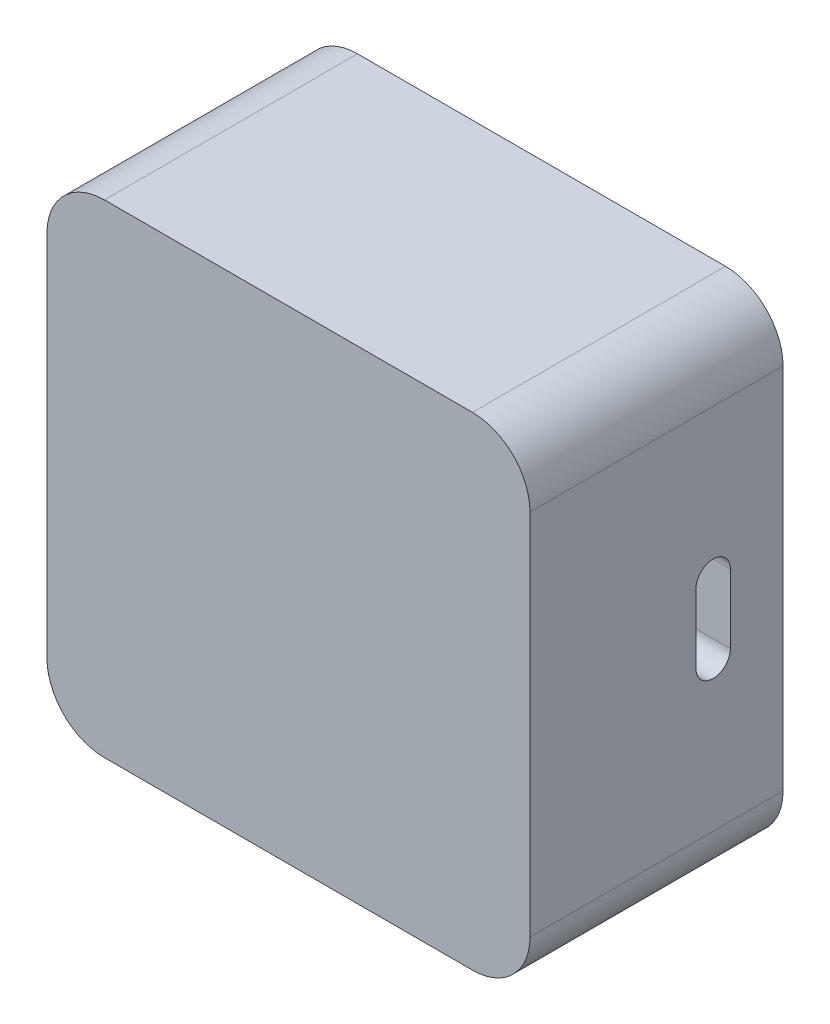
ISO-10303-21;
HEADER;
FILE_DESCRIPTION(('STEP AP214'),'2;1');
FILE_NAME('part.step','',(''),(''),'','','');
FILE_SCHEMA(('AUTOMOTIVE_DESIGN { 1 0 10303 214 1 1 1 1 }'));
ENDSEC;
DATA;
#1=APPLICATION_CONTEXT('core data for automotive mechanical design processes');
#2=APPLICATION_PROTOCOL_DEFINITION('international standard','automotive_design',2000,#1);
#3=PRODUCT_CONTEXT('',#1,'mechanical');
#4=PRODUCT('Part','Part','',(#3));
#5=PRODUCT_RELATED_PRODUCT_CATEGORY('part','',(#4));
#6=PRODUCT_DEFINITION_FORMATION('','',#4);
#7=PRODUCT_DEFINITION_CONTEXT('part definition',#1,'design');
#8=PRODUCT_DEFINITION('design','',#6,#7);
#9=PRODUCT_DEFINITION_SHAPE('','',#8);
#10=(LENGTH_UNIT() NAMED_UNIT(*) SI_UNIT(.MILLI.,.METRE.));
#11=(NAMED_UNIT(*) PLANE_ANGLE_UNIT() SI_UNIT($,.RADIAN.));
#12=(NAMED_UNIT(*) SI_UNIT($,.STERADIAN.) SOLID_ANGLE_UNIT());
#13=UNCERTAINTY_MEASURE_WITH_UNIT(LENGTH_MEASURE(1.E-05),#10,'distance_accuracy_value','');
#14=(GEOMETRIC_REPRESENTATION_CONTEXT(3) GLOBAL_UNCERTAINTY_ASSIGNED_CONTEXT((#13)) GLOBAL_UNIT_ASSIGNED_CONTEXT((#10,
#11,#12)) REPRESENTATION_CONTEXT('',''));
#15=CARTESIAN_POINT('',(0.,0.,0.));
#16=DIRECTION('',(0.,0.,1.));
#17=DIRECTION('',(1.,0.,0.));
#18=AXIS2_PLACEMENT_3D('',#15,#16,#17);
#19=CARTESIAN_POINT('',(-21.,21.,22.));
#20=DIRECTION('',(1.,0.,0.));
#21=DIRECTION('',(0.,0.,-1.));
#22=AXIS2_PLACEMENT_3D('',#19,#20,#21);
#23=PLANE('',#22);
#24=DIRECTION('',(0.,-1.,0.));
#25=VECTOR('',#24,1.);
#26=CARTESIAN_POINT('',(-21.,21.,22.));
#27=LINE('',#26,#25);
#28=CARTESIAN_POINT('',(-21.,16.,22.));
#29=VERTEX_POINT('',#28);
#30=CARTESIAN_POINT('',(-21.,-16.,22.));
#31=VERTEX_POINT('',#30);
#32=EDGE_CURVE('E175',#29,#31,#27,.T.);
#33=ORIENTED_EDGE('',*,*,#32,.F.);
#34=DIRECTION('',(0.,0.,-1.));
#35=VECTOR('',#34,1.);
#36=CARTESIAN_POINT('',(-21.,16.,22.));
#37=LINE('',#36,#35);
#38=CARTESIAN_POINT('',(-21.,16.,0.));
#39=VERTEX_POINT('',#38);
#40=EDGE_CURVE('E197',#29,#39,#37,.T.);
#41=ORIENTED_EDGE('',*,*,#40,.T.);
#42=DIRECTION('',(0.,-1.,0.));
#43=VECTOR('',#42,1.);
#44=CARTESIAN_POINT('',(-21.,21.,0.));
#45=LINE('',#44,#43);
#46=CARTESIAN_POINT('',(-21.,-16.,0.));
#47=VERTEX_POINT('',#46);
#48=EDGE_CURVE('E171',#39,#47,#45,.T.);
#49=ORIENTED_EDGE('',*,*,#48,.T.);
#50=DIRECTION('',(0.,0.,-1.));
#51=VECTOR('',#50,1.);
#52=CARTESIAN_POINT('',(-21.,-16.,22.));
#53=LINE('',#52,#51);
#54=EDGE_CURVE('E186',#47,#31,#53,.F.);
#55=ORIENTED_EDGE('',*,*,#54,.T.);
#56=EDGE_LOOP('',(#33,#41,#49,#55));
#57=FACE_BOUND('',#56,.T.);
#58=ADVANCED_FACE('F39',(#57),#23,.F.);
#59=CARTESIAN_POINT('',(-21.,-21.,22.));
#60=DIRECTION('',(0.,1.,0.));
#61=DIRECTION('',(0.,0.,1.));
#62=AXIS2_PLACEMENT_3D('',#59,#60,#61);
#63=PLANE('',#62);
#64=CARTESIAN_POINT('',(1.56319401867222E-10,-21.,10.9999999999957));
#65=DIRECTION('',(0.,-1.,0.));
#66=DIRECTION('',(0.,0.,-1.));
#67=AXIS2_PLACEMENT_3D('',#64,#65,#66);
#68=CIRCLE('',#67,4.);
#69=CARTESIAN_POINT('',(1.56319401867222E-10,-21.,6.99999999999568));
#70=VERTEX_POINT('',#69);
#71=EDGE_CURVE('E158',#70,#70,#68,.T.);
#72=ORIENTED_EDGE('',*,*,#71,.F.);
#73=EDGE_LOOP('',(#72));
#74=FACE_BOUND('',#73,.T.);
#75=DIRECTION('',(1.,0.,0.));
#76=VECTOR('',#75,1.);
#77=CARTESIAN_POINT('',(-21.,-21.,22.));
#78=LINE('',#77,#76);
#79=CARTESIAN_POINT('',(-16.,-21.,22.));
#80=VERTEX_POINT('',#79);
#81=CARTESIAN_POINT('',(16.,-21.,22.));
#82=VERTEX_POINT('',#81);
#83=EDGE_CURVE('E178',#80,#82,#78,.T.);
#84=ORIENTED_EDGE('',*,*,#83,.F.);
#85=DIRECTION('',(0.,0.,-1.));
#86=VECTOR('',#85,1.);
#87=CARTESIAN_POINT('',(-16.,-21.,22.));
#88=LINE('',#87,#86);
#89=CARTESIAN_POINT('',(-16.,-21.,0.));
#90=VERTEX_POINT('',#89);
#91=EDGE_CURVE('E222',#80,#90,#88,.T.);
#92=ORIENTED_EDGE('',*,*,#91,.T.);
#93=DIRECTION('',(1.,0.,0.));
#94=VECTOR('',#93,1.);
#95=CARTESIAN_POINT('',(-21.,-21.,0.));
#96=LINE('',#95,#94);
#97=CARTESIAN_POINT('',(16.,-21.,0.));
#98=VERTEX_POINT('',#97);
#99=EDGE_CURVE('E189',#90,#98,#96,.T.);
#100=ORIENTED_EDGE('',*,*,#99,.T.);
#101=DIRECTION('',(0.,0.,-1.));
#102=VECTOR('',#101,1.);
#103=CARTESIAN_POINT('',(16.,-21.,22.));
#104=LINE('',#103,#102);
#105=EDGE_CURVE('E220',#98,#82,#104,.F.);
#106=ORIENTED_EDGE('',*,*,#105,.T.);
#107=EDGE_LOOP('',(#84,#92,#100,#106));
#108=FACE_BOUND('',#107,.T.);
#109=ADVANCED_FACE('F228',(#74,#108),#63,.F.);
#110=CARTESIAN_POINT('',(21.,21.,22.));
#111=DIRECTION('',(-1.,0.,0.));
#112=DIRECTION('',(0.,0.,1.));
#113=AXIS2_PLACEMENT_3D('',#110,#111,#112);
#114=PLANE('',#113);
#115=DIRECTION('',(0.,-1.,0.));
#116=VECTOR('',#115,1.);
#117=CARTESIAN_POINT('',(21.,0.,7.57507844989522));
#118=LINE('',#117,#116);
#119=CARTESIAN_POINT('',(21.,3.,7.57507844989522));
#120=VERTEX_POINT('',#119);
#121=CARTESIAN_POINT('',(21.,-3.00000000000001,7.57507844989522));
#122=VERTEX_POINT('',#121);
#123=EDGE_CURVE('E164',#120,#122,#118,.T.);
#124=ORIENTED_EDGE('',*,*,#123,.F.);
#125=CARTESIAN_POINT('',(21.,3.,6.07507844989522));
#126=DIRECTION('',(1.,0.,0.));
#127=DIRECTION('',(0.,0.,-1.));
#128=AXIS2_PLACEMENT_3D('',#125,#126,#127);
#129=CIRCLE('',#128,1.5);
#130=CARTESIAN_POINT('',(21.,3.,4.57507844989522));
#131=VERTEX_POINT('',#130);
#132=EDGE_CURVE('E135',#131,#120,#129,.T.);
#133=ORIENTED_EDGE('',*,*,#132,.F.);
#134=DIRECTION('',(0.,-1.,0.));
#135=VECTOR('',#134,1.);
#136=CARTESIAN_POINT('',(21.,0.,4.57507844989522));
#137=LINE('',#136,#135);
#138=CARTESIAN_POINT('',(21.,-3.00000000000001,4.57507844989522));
#139=VERTEX_POINT('',#138);
#140=EDGE_CURVE('E152',#131,#139,#137,.T.);
#141=ORIENTED_EDGE('',*,*,#140,.T.);
#142=CARTESIAN_POINT('',(21.,-3.00000000000001,6.07507844989522));
#143=DIRECTION('',(1.,0.,0.));
#144=DIRECTION('',(0.,0.,-1.));
#145=AXIS2_PLACEMENT_3D('',#142,#143,#144);
#146=CIRCLE('',#145,1.5);
#147=EDGE_CURVE('E155',#139,#122,#146,.F.);
#148=ORIENTED_EDGE('',*,*,#147,.T.);
#149=EDGE_LOOP('',(#124,#133,#141,#148));
#150=FACE_BOUND('',#149,.T.);
#151=DIRECTION('',(0.,1.,0.));
#152=VECTOR('',#151,1.);
#153=CARTESIAN_POINT('',(21.,21.,22.));
#154=LINE('',#153,#152);
#155=CARTESIAN_POINT('',(21.,-16.,22.));
#156=VERTEX_POINT('',#155);
#157=CARTESIAN_POINT('',(21.,16.,22.));
#158=VERTEX_POINT('',#157);
#159=EDGE_CURVE('E181',#156,#158,#154,.T.);
#160=ORIENTED_EDGE('',*,*,#159,.F.);
#161=DIRECTION('',(0.,0.,-1.));
#162=VECTOR('',#161,1.);
#163=CARTESIAN_POINT('',(21.,-16.,22.));
#164=LINE('',#163,#162);
#165=CARTESIAN_POINT('',(21.,-16.,0.));
#166=VERTEX_POINT('',#165);
#167=EDGE_CURVE('E11',#156,#166,#164,.T.);
#168=ORIENTED_EDGE('',*,*,#167,.T.);
#169=DIRECTION('',(0.,1.,0.));
#170=VECTOR('',#169,1.);
#171=CARTESIAN_POINT('',(21.,21.,0.));
#172=LINE('',#171,#170);
#173=CARTESIAN_POINT('',(21.,16.,0.));
#174=VERTEX_POINT('',#173);
#175=EDGE_CURVE('E192',#166,#174,#172,.T.);
#176=ORIENTED_EDGE('',*,*,#175,.T.);
#177=DIRECTION('',(0.,0.,-1.));
#178=VECTOR('',#177,1.);
#179=CARTESIAN_POINT('',(21.,16.,22.));
#180=LINE('',#179,#178);
#181=EDGE_CURVE('E47',#174,#158,#180,.F.);
#182=ORIENTED_EDGE('',*,*,#181,.T.);
#183=EDGE_LOOP('',(#160,#168,#176,#182));
#184=FACE_BOUND('',#183,.T.);
#185=ADVANCED_FACE('F239',(#150,#184),#114,.F.);
#186=CARTESIAN_POINT('',(-21.,21.,22.));
#187=DIRECTION('',(0.,-1.,0.));
#188=DIRECTION('',(1.,0.,0.));
#189=AXIS2_PLACEMENT_3D('',#186,#187,#188);
#190=PLANE('',#189);
#191=DIRECTION('',(-1.,0.,0.));
#192=VECTOR('',#191,1.);
#193=CARTESIAN_POINT('',(-21.,21.,0.));
#194=LINE('',#193,#192);
#195=CARTESIAN_POINT('',(16.,21.,0.));
#196=VERTEX_POINT('',#195);
#197=CARTESIAN_POINT('',(-16.,21.,0.));
#198=VERTEX_POINT('',#197);
#199=EDGE_CURVE('E179',#196,#198,#194,.T.);
#200=ORIENTED_EDGE('',*,*,#199,.T.);
#201=DIRECTION('',(0.,0.,-1.));
#202=VECTOR('',#201,1.);
#203=CARTESIAN_POINT('',(-16.,21.,22.));
#204=LINE('',#203,#202);
#205=CARTESIAN_POINT('',(-16.,21.,22.));
#206=VERTEX_POINT('',#205);
#207=EDGE_CURVE('E211',#198,#206,#204,.F.);
#208=ORIENTED_EDGE('',*,*,#207,.T.);
#209=DIRECTION('',(-1.,0.,0.));
#210=VECTOR('',#209,1.);
#211=CARTESIAN_POINT('',(-21.,21.,22.));
#212=LINE('',#211,#210);
#213=CARTESIAN_POINT('',(16.,21.,22.));
#214=VERTEX_POINT('',#213);
#215=EDGE_CURVE('E183',#214,#206,#212,.T.);
#216=ORIENTED_EDGE('',*,*,#215,.F.);
#217=DIRECTION('',(0.,0.,-1.));
#218=VECTOR('',#217,1.);
#219=CARTESIAN_POINT('',(16.,21.,22.));
#220=LINE('',#219,#218);
#221=EDGE_CURVE('E208',#214,#196,#220,.T.);
#222=ORIENTED_EDGE('',*,*,#221,.T.);
#223=EDGE_LOOP('',(#200,#208,#216,#222));
#224=FACE_BOUND('',#223,.T.);
#225=ADVANCED_FACE('F247',(#224),#190,.F.);
#226=CARTESIAN_POINT('',(0.,0.,22.));
#227=DIRECTION('',(0.,0.,1.));
#228=DIRECTION('',(1.,0.,0.));
#229=AXIS2_PLACEMENT_3D('',#226,#227,#228);
#230=PLANE('',#229);
#231=ORIENTED_EDGE('',*,*,#215,.T.);
#232=CARTESIAN_POINT('',(-16.,16.,22.));
#233=DIRECTION('',(0.,0.,1.));
#234=DIRECTION('',(1.,0.,0.));
#235=AXIS2_PLACEMENT_3D('',#232,#233,#234);
#236=CIRCLE('',#235,5.);
#237=EDGE_CURVE('E218',#206,#29,#236,.T.);
#238=ORIENTED_EDGE('',*,*,#237,.T.);
#239=ORIENTED_EDGE('',*,*,#32,.T.);
#240=CARTESIAN_POINT('',(-16.,-16.,22.));
#241=DIRECTION('',(0.,0.,1.));
#242=DIRECTION('',(1.,0.,0.));
#243=AXIS2_PLACEMENT_3D('',#240,#241,#242);
#244=CIRCLE('',#243,5.);
#245=EDGE_CURVE('E216',#31,#80,#244,.T.);
#246=ORIENTED_EDGE('',*,*,#245,.T.);
#247=ORIENTED_EDGE('',*,*,#83,.T.);
#248=CARTESIAN_POINT('',(16.,-16.,22.));
#249=DIRECTION('',(0.,0.,1.));
#250=DIRECTION('',(1.,0.,0.));
#251=AXIS2_PLACEMENT_3D('',#248,#249,#250);
#252=CIRCLE('',#251,5.);
#253=EDGE_CURVE('E60',#82,#156,#252,.T.);
#254=ORIENTED_EDGE('',*,*,#253,.T.);
#255=ORIENTED_EDGE('',*,*,#159,.T.);
#256=CARTESIAN_POINT('',(16.,16.,22.));
#257=DIRECTION('',(0.,0.,1.));
#258=DIRECTION('',(1.,0.,0.));
#259=AXIS2_PLACEMENT_3D('',#256,#257,#258);
#260=CIRCLE('',#259,5.);
#261=EDGE_CURVE('E213',#158,#214,#260,.T.);
#262=ORIENTED_EDGE('',*,*,#261,.T.);
#263=EDGE_LOOP('',(#231,#238,#239,#246,#247,#254,#255,#262));
#264=FACE_BOUND('',#263,.T.);
#265=ADVANCED_FACE('F241',(#264),#230,.T.);
#266=CARTESIAN_POINT('',(0.,0.,0.));
#267=DIRECTION('',(0.,0.,1.));
#268=DIRECTION('',(1.,0.,0.));
#269=AXIS2_PLACEMENT_3D('',#266,#267,#268);
#270=PLANE('',#269);
#271=ORIENTED_EDGE('',*,*,#48,.F.);
#272=CARTESIAN_POINT('',(-16.,16.,0.));
#273=DIRECTION('',(0.,0.,1.));
#274=DIRECTION('',(1.,0.,0.));
#275=AXIS2_PLACEMENT_3D('',#272,#273,#274);
#276=CIRCLE('',#275,5.);
#277=EDGE_CURVE('E206',#39,#198,#276,.F.);
#278=ORIENTED_EDGE('',*,*,#277,.T.);
#279=ORIENTED_EDGE('',*,*,#199,.F.);
#280=CARTESIAN_POINT('',(16.,16.,0.));
#281=DIRECTION('',(0.,0.,1.));
#282=DIRECTION('',(1.,0.,0.));
#283=AXIS2_PLACEMENT_3D('',#280,#281,#282);
#284=CIRCLE('',#283,5.);
#285=EDGE_CURVE('E200',#196,#174,#284,.F.);
#286=ORIENTED_EDGE('',*,*,#285,.T.);
#287=ORIENTED_EDGE('',*,*,#175,.F.);
#288=CARTESIAN_POINT('',(16.,-16.,0.));
#289=DIRECTION('',(0.,0.,1.));
#290=DIRECTION('',(1.,0.,0.));
#291=AXIS2_PLACEMENT_3D('',#288,#289,#290);
#292=CIRCLE('',#291,5.);
#293=EDGE_CURVE('E202',#166,#98,#292,.F.);
#294=ORIENTED_EDGE('',*,*,#293,.T.);
#295=ORIENTED_EDGE('',*,*,#99,.F.);
#296=CARTESIAN_POINT('',(-16.,-16.,0.));
#297=DIRECTION('',(0.,0.,1.));
#298=DIRECTION('',(1.,0.,0.));
#299=AXIS2_PLACEMENT_3D('',#296,#297,#298);
#300=CIRCLE('',#299,5.);
#301=EDGE_CURVE('E204',#90,#47,#300,.F.);
#302=ORIENTED_EDGE('',*,*,#301,.T.);
#303=EDGE_LOOP('',(#271,#278,#279,#286,#287,#294,#295,#302));
#304=FACE_BOUND('',#303,.T.);
#305=ADVANCED_FACE('F234',(#304),#270,.F.);
#306=CARTESIAN_POINT('',(14.,3.,6.07507844989522));
#307=DIRECTION('',(1.,0.,0.));
#308=DIRECTION('',(0.,0.,-1.));
#309=AXIS2_PLACEMENT_3D('',#306,#307,#308);
#310=CYLINDRICAL_SURFACE('',#309,1.5);
#311=ORIENTED_EDGE('',*,*,#132,.T.);
#312=DIRECTION('',(1.,0.,0.));
#313=VECTOR('',#312,1.);
#314=CARTESIAN_POINT('',(14.,3.,7.57507844989522));
#315=LINE('',#314,#313);
#316=CARTESIAN_POINT('',(14.,3.,7.57507844989522));
#317=VERTEX_POINT('',#316);
#318=EDGE_CURVE('E129',#317,#120,#315,.T.);
#319=ORIENTED_EDGE('',*,*,#318,.F.);
#320=CARTESIAN_POINT('',(14.,3.,6.07507844989522));
#321=DIRECTION('',(1.,0.,0.));
#322=DIRECTION('',(0.,0.,-1.));
#323=AXIS2_PLACEMENT_3D('',#320,#321,#322);
#324=CIRCLE('',#323,1.5);
#325=CARTESIAN_POINT('',(14.,3.,4.57507844989522));
#326=VERTEX_POINT('',#325);
#327=EDGE_CURVE('E133',#326,#317,#324,.T.);
#328=ORIENTED_EDGE('',*,*,#327,.F.);
#329=DIRECTION('',(1.,0.,0.));
#330=VECTOR('',#329,1.);
#331=CARTESIAN_POINT('',(14.,3.,4.57507844989522));
#332=LINE('',#331,#330);
#333=EDGE_CURVE('E169',#326,#131,#332,.T.);
#334=ORIENTED_EDGE('',*,*,#333,.T.);
#335=EDGE_LOOP('',(#311,#319,#328,#334));
#336=FACE_BOUND('',#335,.T.);
#337=ADVANCED_FACE('F131',(#336),#310,.F.);
#338=CARTESIAN_POINT('',(14.,0.,4.57507844989522));
#339=DIRECTION('',(0.,0.,1.));
#340=DIRECTION('',(1.,0.,0.));
#341=AXIS2_PLACEMENT_3D('',#338,#339,#340);
#342=PLANE('',#341);
#343=ORIENTED_EDGE('',*,*,#140,.F.);
#344=ORIENTED_EDGE('',*,*,#333,.F.);
#345=DIRECTION('',(0.,-1.,0.));
#346=VECTOR('',#345,1.);
#347=CARTESIAN_POINT('',(14.,0.,4.57507844989522));
#348=LINE('',#347,#346);
#349=CARTESIAN_POINT('',(14.,-3.00000000000001,4.57507844989522));
#350=VERTEX_POINT('',#349);
#351=EDGE_CURVE('E140',#326,#350,#348,.T.);
#352=ORIENTED_EDGE('',*,*,#351,.T.);
#353=DIRECTION('',(1.,0.,0.));
#354=VECTOR('',#353,1.);
#355=CARTESIAN_POINT('',(14.,-3.00000000000001,4.57507844989522));
#356=LINE('',#355,#354);
#357=EDGE_CURVE('E172',#350,#139,#356,.T.);
#358=ORIENTED_EDGE('',*,*,#357,.T.);
#359=EDGE_LOOP('',(#343,#344,#352,#358));
#360=FACE_BOUND('',#359,.T.);
#361=ADVANCED_FACE('F284',(#360),#342,.T.);
#362=CARTESIAN_POINT('',(14.,-3.00000000000001,6.07507844989522));
#363=DIRECTION('',(1.,0.,0.));
#364=DIRECTION('',(0.,0.,-1.));
#365=AXIS2_PLACEMENT_3D('',#362,#363,#364);
#366=CYLINDRICAL_SURFACE('',#365,1.5);
#367=ORIENTED_EDGE('',*,*,#147,.F.);
#368=ORIENTED_EDGE('',*,*,#357,.F.);
#369=CARTESIAN_POINT('',(14.,-3.00000000000001,6.07507844989522));
#370=DIRECTION('',(1.,0.,0.));
#371=DIRECTION('',(0.,0.,-1.));
#372=AXIS2_PLACEMENT_3D('',#369,#370,#371);
#373=CIRCLE('',#372,1.5);
#374=CARTESIAN_POINT('',(14.,-3.00000000000001,7.57507844989522));
#375=VERTEX_POINT('',#374);
#376=EDGE_CURVE('E148',#350,#375,#373,.F.);
#377=ORIENTED_EDGE('',*,*,#376,.T.);
#378=DIRECTION('',(1.,0.,0.));
#379=VECTOR('',#378,1.);
#380=CARTESIAN_POINT('',(14.,-3.00000000000001,7.57507844989522));
#381=LINE('',#380,#379);
#382=EDGE_CURVE('E139',#375,#122,#381,.T.);
#383=ORIENTED_EDGE('',*,*,#382,.T.);
#384=EDGE_LOOP('',(#367,#368,#377,#383));
#385=FACE_BOUND('',#384,.T.);
#386=ADVANCED_FACE('F287',(#385),#366,.F.);
#387=CARTESIAN_POINT('',(14.,0.,7.57507844989522));
#388=DIRECTION('',(0.,0.,1.));
#389=DIRECTION('',(1.,0.,0.));
#390=AXIS2_PLACEMENT_3D('',#387,#388,#389);
#391=PLANE('',#390);
#392=ORIENTED_EDGE('',*,*,#123,.T.);
#393=ORIENTED_EDGE('',*,*,#382,.F.);
#394=DIRECTION('',(0.,-1.,0.));
#395=VECTOR('',#394,1.);
#396=CARTESIAN_POINT('',(14.,0.,7.57507844989522));
#397=LINE('',#396,#395);
#398=EDGE_CURVE('E144',#317,#375,#397,.T.);
#399=ORIENTED_EDGE('',*,*,#398,.F.);
#400=ORIENTED_EDGE('',*,*,#318,.T.);
#401=EDGE_LOOP('',(#392,#393,#399,#400));
#402=FACE_BOUND('',#401,.T.);
#403=ADVANCED_FACE('F145',(#402),#391,.F.);
#404=CARTESIAN_POINT('',(14.,0.,0.));
#405=DIRECTION('',(1.,0.,0.));
#406=DIRECTION('',(0.,0.,-1.));
#407=AXIS2_PLACEMENT_3D('',#404,#405,#406);
#408=PLANE('',#407);
#409=ORIENTED_EDGE('',*,*,#327,.T.);
#410=ORIENTED_EDGE('',*,*,#398,.T.);
#411=ORIENTED_EDGE('',*,*,#376,.F.);
#412=ORIENTED_EDGE('',*,*,#351,.F.);
#413=EDGE_LOOP('',(#409,#410,#411,#412));
#414=FACE_BOUND('',#413,.T.);
#415=ADVANCED_FACE('F151',(#414),#408,.T.);
#416=CARTESIAN_POINT('',(1.56319401867222E-10,-11.,10.9999999999957));
#417=DIRECTION('',(0.,-1.,0.));
#418=DIRECTION('',(0.,0.,-1.));
#419=AXIS2_PLACEMENT_3D('',#416,#417,#418);
#420=CYLINDRICAL_SURFACE('',#419,4.);
#421=CARTESIAN_POINT('',(1.56319401867222E-10,-11.,10.9999999999957));
#422=DIRECTION('',(0.,-1.,0.));
#423=DIRECTION('',(0.,0.,-1.));
#424=AXIS2_PLACEMENT_3D('',#421,#422,#423);
#425=CIRCLE('',#424,4.);
#426=CARTESIAN_POINT('',(1.56319401867222E-10,-11.,6.99999999999568));
#427=VERTEX_POINT('',#426);
#428=EDGE_CURVE('E165',#427,#427,#425,.T.);
#429=ORIENTED_EDGE('',*,*,#428,.F.);
#430=EDGE_LOOP('',(#429));
#431=FACE_BOUND('',#430,.T.);
#432=ORIENTED_EDGE('',*,*,#71,.T.);
#433=EDGE_LOOP('',(#432));
#434=FACE_BOUND('',#433,.T.);
#435=ADVANCED_FACE('F296',(#431,#434),#420,.F.);
#436=CARTESIAN_POINT('',(1.56319401867222E-10,-11.,10.9999999999957));
#437=DIRECTION('',(0.,-1.,0.));
#438=DIRECTION('',(0.,0.,-1.));
#439=AXIS2_PLACEMENT_3D('',#436,#437,#438);
#440=PLANE('',#439);
#441=ORIENTED_EDGE('',*,*,#428,.T.);
#442=EDGE_LOOP('',(#441));
#443=FACE_BOUND('',#442,.T.);
#444=ADVANCED_FACE('F263',(#443),#440,.T.);
#445=CARTESIAN_POINT('',(-16.,16.,22.));
#446=DIRECTION('',(0.,0.,-1.));
#447=DIRECTION('',(-1.,0.,0.));
#448=AXIS2_PLACEMENT_3D('',#445,#446,#447);
#449=CYLINDRICAL_SURFACE('',#448,5.);
#450=ORIENTED_EDGE('',*,*,#237,.F.);
#451=ORIENTED_EDGE('',*,*,#207,.F.);
#452=ORIENTED_EDGE('',*,*,#277,.F.);
#453=ORIENTED_EDGE('',*,*,#40,.F.);
#454=EDGE_LOOP('',(#450,#451,#452,#453));
#455=FACE_BOUND('',#454,.T.);
#456=ADVANCED_FACE('F252',(#455),#449,.T.);
#457=CARTESIAN_POINT('',(-16.,-16.,22.));
#458=DIRECTION('',(0.,0.,-1.));
#459=DIRECTION('',(-1.,0.,0.));
#460=AXIS2_PLACEMENT_3D('',#457,#458,#459);
#461=CYLINDRICAL_SURFACE('',#460,5.);
#462=ORIENTED_EDGE('',*,*,#245,.F.);
#463=ORIENTED_EDGE('',*,*,#54,.F.);
#464=ORIENTED_EDGE('',*,*,#301,.F.);
#465=ORIENTED_EDGE('',*,*,#91,.F.);
#466=EDGE_LOOP('',(#462,#463,#464,#465));
#467=FACE_BOUND('',#466,.T.);
#468=ADVANCED_FACE('F256',(#467),#461,.T.);
#469=CARTESIAN_POINT('',(16.,-16.,22.));
#470=DIRECTION('',(0.,0.,-1.));
#471=DIRECTION('',(-1.,0.,0.));
#472=AXIS2_PLACEMENT_3D('',#469,#470,#471);
#473=CYLINDRICAL_SURFACE('',#472,5.);
#474=ORIENTED_EDGE('',*,*,#253,.F.);
#475=ORIENTED_EDGE('',*,*,#105,.F.);
#476=ORIENTED_EDGE('',*,*,#293,.F.);
#477=ORIENTED_EDGE('',*,*,#167,.F.);
#478=EDGE_LOOP('',(#474,#475,#476,#477));
#479=FACE_BOUND('',#478,.T.);
#480=ADVANCED_FACE('F238',(#479),#473,.T.);
#481=CARTESIAN_POINT('',(16.,16.,22.));
#482=DIRECTION('',(0.,0.,-1.));
#483=DIRECTION('',(-1.,0.,0.));
#484=AXIS2_PLACEMENT_3D('',#481,#482,#483);
#485=CYLINDRICAL_SURFACE('',#484,5.);
#486=ORIENTED_EDGE('',*,*,#261,.F.);
#487=ORIENTED_EDGE('',*,*,#181,.F.);
#488=ORIENTED_EDGE('',*,*,#285,.F.);
#489=ORIENTED_EDGE('',*,*,#221,.F.);
#490=EDGE_LOOP('',(#486,#487,#488,#489));
#491=FACE_BOUND('',#490,.T.);
#492=ADVANCED_FACE('F41',(#491),#485,.T.);
#493=CLOSED_SHELL('',(#58,#109,#185,#225,#265,#305,#337,#361,#386,#403,#415,#435,#444,#456,#468,
#480,#492));
#494=MANIFOLD_SOLID_BREP('B2',#493);
#495=ADVANCED_BREP_SHAPE_REPRESENTATION('',(#18,#494),#14);
#496=SHAPE_DEFINITION_REPRESENTATION(#9,#495);
ENDSEC;
END-ISO-10303-21;
